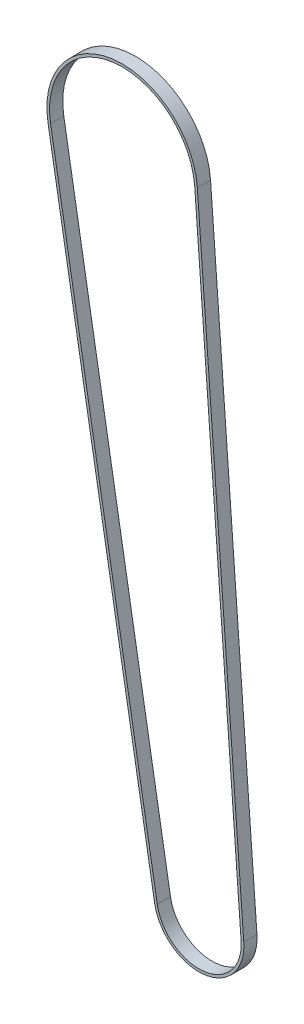
ISO-10303-21;
HEADER;
FILE_DESCRIPTION(('STEP AP214'),'2;1');
FILE_NAME('part.step','',(''),(''),'','','');
FILE_SCHEMA(('AUTOMOTIVE_DESIGN { 1 0 10303 214 1 1 1 1 }'));
ENDSEC;
DATA;
#1=APPLICATION_CONTEXT('core data for automotive mechanical design processes');
#2=APPLICATION_PROTOCOL_DEFINITION('international standard','automotive_design',2000,#1);
#3=PRODUCT_CONTEXT('',#1,'mechanical');
#4=PRODUCT('Part','Part','',(#3));
#5=PRODUCT_RELATED_PRODUCT_CATEGORY('part','',(#4));
#6=PRODUCT_DEFINITION_FORMATION('','',#4);
#7=PRODUCT_DEFINITION_CONTEXT('part definition',#1,'design');
#8=PRODUCT_DEFINITION('design','',#6,#7);
#9=PRODUCT_DEFINITION_SHAPE('','',#8);
#10=(LENGTH_UNIT() NAMED_UNIT(*) SI_UNIT(.MILLI.,.METRE.));
#11=(NAMED_UNIT(*) PLANE_ANGLE_UNIT() SI_UNIT($,.RADIAN.));
#12=(NAMED_UNIT(*) SI_UNIT($,.STERADIAN.) SOLID_ANGLE_UNIT());
#13=UNCERTAINTY_MEASURE_WITH_UNIT(LENGTH_MEASURE(1.E-05),#10,'distance_accuracy_value','');
#14=(GEOMETRIC_REPRESENTATION_CONTEXT(3) GLOBAL_UNCERTAINTY_ASSIGNED_CONTEXT((#13)) GLOBAL_UNIT_ASSIGNED_CONTEXT((#10,
#11,#12)) REPRESENTATION_CONTEXT('',''));
#15=CARTESIAN_POINT('',(0.,0.,0.));
#16=DIRECTION('',(0.,0.,1.));
#17=DIRECTION('',(1.,0.,0.));
#18=AXIS2_PLACEMENT_3D('',#15,#16,#17);
#19=CARTESIAN_POINT('',(0.,0.,10.));
#20=DIRECTION('',(0.,0.,-1.));
#21=DIRECTION('',(-1.,0.,0.));
#22=AXIS2_PLACEMENT_3D('',#19,#20,#21);
#23=PLANE('',#22);
#24=CARTESIAN_POINT('',(0.,0.,10.));
#25=DIRECTION('',(0.,0.,1.));
#26=DIRECTION('',(-1.,0.,0.));
#27=AXIS2_PLACEMENT_3D('',#24,#25,#26);
#28=CIRCLE('',#27,114.);
#29=CARTESIAN_POINT('',(113.692130056024,8.37254819777314,10.));
#30=VERTEX_POINT('',#29);
#31=CARTESIAN_POINT('',(-112.362949875635,-19.2501297462014,10.));
#32=VERTEX_POINT('',#31);
#33=EDGE_CURVE('E140',#30,#32,#28,.T.);
#34=ORIENTED_EDGE('',*,*,#33,.T.);
#35=DIRECTION('',(0.168860787247381,-0.985639911189779,0.));
#36=VECTOR('',#35,1.);
#37=CARTESIAN_POINT('',(49.0612210280597,-961.482533532823,10.));
#38=LINE('',#37,#36);
#39=CARTESIAN_POINT('',(49.0612210280597,-961.482533532823,10.));
#40=VERTEX_POINT('',#39);
#41=EDGE_CURVE('E143',#32,#40,#38,.T.);
#42=ORIENTED_EDGE('',*,*,#41,.T.);
#43=CARTESIAN_POINT('',(116.084734988965,-950.000000000001,10.));
#44=DIRECTION('',(0.,0.,1.));
#45=DIRECTION('',(-1.,0.,0.));
#46=AXIS2_PLACEMENT_3D('',#43,#44,#45);
#47=CIRCLE('',#46,68.);
#48=CARTESIAN_POINT('',(183.901093267997,-945.005848443435,10.));
#49=VERTEX_POINT('',#48);
#50=EDGE_CURVE('E146',#40,#49,#47,.T.);
#51=ORIENTED_EDGE('',*,*,#50,.T.);
#52=DIRECTION('',(-0.0734434052436241,0.997299386456355,0.));
#53=VECTOR('',#52,1.);
#54=CARTESIAN_POINT('',(113.692130056024,8.37254819777314,10.));
#55=LINE('',#54,#53);
#56=EDGE_CURVE('E148',#49,#30,#55,.T.);
#57=ORIENTED_EDGE('',*,*,#56,.T.);
#58=EDGE_LOOP('',(#34,#42,#51,#57));
#59=FACE_BOUND('',#58,.T.);
#60=CARTESIAN_POINT('',(0.,0.,10.));
#61=DIRECTION('',(0.,0.,1.));
#62=DIRECTION('',(-1.,0.,0.));
#63=AXIS2_PLACEMENT_3D('',#60,#61,#62);
#64=CIRCLE('',#63,110.);
#65=CARTESIAN_POINT('',(109.702932510199,8.07877457679865,10.));
#66=VERTEX_POINT('',#65);
#67=CARTESIAN_POINT('',(-108.420390230876,-18.5746865972119,10.));
#68=VERTEX_POINT('',#67);
#69=EDGE_CURVE('E104',#66,#68,#64,.T.);
#70=ORIENTED_EDGE('',*,*,#69,.F.);
#71=DIRECTION('',(-0.073443405243624,0.997299386456354,0.));
#72=VECTOR('',#71,1.);
#73=CARTESIAN_POINT('',(109.702932510199,8.07877457679865,10.));
#74=LINE('',#73,#72);
#75=CARTESIAN_POINT('',(179.911895722171,-945.29962206441,10.));
#76=VERTEX_POINT('',#75);
#77=EDGE_CURVE('E126',#76,#66,#74,.T.);
#78=ORIENTED_EDGE('',*,*,#77,.F.);
#79=CARTESIAN_POINT('',(116.084734988965,-950.000000000001,10.));
#80=DIRECTION('',(0.,0.,1.));
#81=DIRECTION('',(-1.,0.,0.));
#82=AXIS2_PLACEMENT_3D('',#79,#80,#81);
#83=CIRCLE('',#82,64.);
#84=CARTESIAN_POINT('',(53.0037806728188,-960.807090383834,10.));
#85=VERTEX_POINT('',#84);
#86=EDGE_CURVE('E124',#85,#76,#83,.T.);
#87=ORIENTED_EDGE('',*,*,#86,.F.);
#88=DIRECTION('',(0.168860787247381,-0.985639911189779,0.));
#89=VECTOR('',#88,1.);
#90=CARTESIAN_POINT('',(53.0037806728188,-960.807090383834,10.));
#91=LINE('',#90,#89);
#92=EDGE_CURVE('E112',#68,#85,#91,.T.);
#93=ORIENTED_EDGE('',*,*,#92,.F.);
#94=EDGE_LOOP('',(#70,#78,#87,#93));
#95=FACE_BOUND('',#94,.T.);
#96=ADVANCED_FACE('F39',(#59,#95),#23,.F.);
#97=CARTESIAN_POINT('',(0.,0.,-10.));
#98=DIRECTION('',(0.,0.,-1.));
#99=DIRECTION('',(-1.,0.,0.));
#100=AXIS2_PLACEMENT_3D('',#97,#98,#99);
#101=PLANE('',#100);
#102=CARTESIAN_POINT('',(0.,0.,-10.));
#103=DIRECTION('',(0.,0.,1.));
#104=DIRECTION('',(-1.,0.,0.));
#105=AXIS2_PLACEMENT_3D('',#102,#103,#104);
#106=CIRCLE('',#105,114.);
#107=CARTESIAN_POINT('',(113.692130056024,8.37254819777314,-10.));
#108=VERTEX_POINT('',#107);
#109=CARTESIAN_POINT('',(-112.362949875635,-19.2501297462014,-10.));
#110=VERTEX_POINT('',#109);
#111=EDGE_CURVE('E120',#108,#110,#106,.T.);
#112=ORIENTED_EDGE('',*,*,#111,.F.);
#113=DIRECTION('',(-0.0734434052436241,0.997299386456355,0.));
#114=VECTOR('',#113,1.);
#115=CARTESIAN_POINT('',(113.692130056024,8.37254819777314,-10.));
#116=LINE('',#115,#114);
#117=CARTESIAN_POINT('',(183.901093267997,-945.005848443435,-10.));
#118=VERTEX_POINT('',#117);
#119=EDGE_CURVE('E144',#118,#108,#116,.T.);
#120=ORIENTED_EDGE('',*,*,#119,.F.);
#121=CARTESIAN_POINT('',(116.084734988965,-950.000000000001,-10.));
#122=DIRECTION('',(0.,0.,1.));
#123=DIRECTION('',(-1.,0.,0.));
#124=AXIS2_PLACEMENT_3D('',#121,#122,#123);
#125=CIRCLE('',#124,68.);
#126=CARTESIAN_POINT('',(49.0612210280597,-961.482533532823,-10.));
#127=VERTEX_POINT('',#126);
#128=EDGE_CURVE('E155',#127,#118,#125,.T.);
#129=ORIENTED_EDGE('',*,*,#128,.F.);
#130=DIRECTION('',(0.168860787247381,-0.985639911189779,0.));
#131=VECTOR('',#130,1.);
#132=CARTESIAN_POINT('',(49.0612210280597,-961.482533532823,-10.));
#133=LINE('',#132,#131);
#134=EDGE_CURVE('E153',#110,#127,#133,.T.);
#135=ORIENTED_EDGE('',*,*,#134,.F.);
#136=EDGE_LOOP('',(#112,#120,#129,#135));
#137=FACE_BOUND('',#136,.T.);
#138=DIRECTION('',(-0.073443405243624,0.997299386456354,0.));
#139=VECTOR('',#138,1.);
#140=CARTESIAN_POINT('',(109.702932510199,8.07877457679865,-10.));
#141=LINE('',#140,#139);
#142=CARTESIAN_POINT('',(179.911895722171,-945.29962206441,-10.));
#143=VERTEX_POINT('',#142);
#144=CARTESIAN_POINT('',(109.702932510199,8.07877457679865,-10.));
#145=VERTEX_POINT('',#144);
#146=EDGE_CURVE('E113',#143,#145,#141,.T.);
#147=ORIENTED_EDGE('',*,*,#146,.T.);
#148=CARTESIAN_POINT('',(0.,0.,-10.));
#149=DIRECTION('',(0.,0.,1.));
#150=DIRECTION('',(-1.,0.,0.));
#151=AXIS2_PLACEMENT_3D('',#148,#149,#150);
#152=CIRCLE('',#151,110.);
#153=CARTESIAN_POINT('',(-108.420390230876,-18.5746865972119,-10.));
#154=VERTEX_POINT('',#153);
#155=EDGE_CURVE('E62',#145,#154,#152,.T.);
#156=ORIENTED_EDGE('',*,*,#155,.T.);
#157=DIRECTION('',(0.168860787247381,-0.985639911189779,0.));
#158=VECTOR('',#157,1.);
#159=CARTESIAN_POINT('',(53.0037806728188,-960.807090383834,-10.));
#160=LINE('',#159,#158);
#161=CARTESIAN_POINT('',(53.0037806728188,-960.807090383834,-10.));
#162=VERTEX_POINT('',#161);
#163=EDGE_CURVE('E119',#154,#162,#160,.T.);
#164=ORIENTED_EDGE('',*,*,#163,.T.);
#165=CARTESIAN_POINT('',(116.084734988965,-950.000000000001,-10.));
#166=DIRECTION('',(0.,0.,1.));
#167=DIRECTION('',(-1.,0.,0.));
#168=AXIS2_PLACEMENT_3D('',#165,#166,#167);
#169=CIRCLE('',#168,64.);
#170=EDGE_CURVE('E132',#162,#143,#169,.T.);
#171=ORIENTED_EDGE('',*,*,#170,.T.);
#172=EDGE_LOOP('',(#147,#156,#164,#171));
#173=FACE_BOUND('',#172,.T.);
#174=ADVANCED_FACE('F173',(#137,#173),#101,.T.);
#175=CARTESIAN_POINT('',(0.,0.,10.));
#176=DIRECTION('',(0.,0.,-1.));
#177=DIRECTION('',(-1.,0.,0.));
#178=AXIS2_PLACEMENT_3D('',#175,#176,#177);
#179=CYLINDRICAL_SURFACE('',#178,114.);
#180=ORIENTED_EDGE('',*,*,#111,.T.);
#181=DIRECTION('',(0.,0.,-1.));
#182=VECTOR('',#181,1.);
#183=CARTESIAN_POINT('',(-112.362949875635,-19.2501297462014,10.));
#184=LINE('',#183,#182);
#185=EDGE_CURVE('E11',#32,#110,#184,.T.);
#186=ORIENTED_EDGE('',*,*,#185,.F.);
#187=ORIENTED_EDGE('',*,*,#33,.F.);
#188=DIRECTION('',(0.,0.,-1.));
#189=VECTOR('',#188,1.);
#190=CARTESIAN_POINT('',(113.692130056024,8.37254819777314,10.));
#191=LINE('',#190,#189);
#192=EDGE_CURVE('E150',#30,#108,#191,.T.);
#193=ORIENTED_EDGE('',*,*,#192,.T.);
#194=EDGE_LOOP('',(#180,#186,#187,#193));
#195=FACE_BOUND('',#194,.T.);
#196=ADVANCED_FACE('F41',(#195),#179,.T.);
#197=CARTESIAN_POINT('',(49.0612210280597,-961.482533532823,10.));
#198=DIRECTION('',(0.985639911189779,0.168860787247381,0.));
#199=DIRECTION('',(-0.168860787247381,0.985639911189779,0.));
#200=AXIS2_PLACEMENT_3D('',#197,#198,#199);
#201=PLANE('',#200);
#202=ORIENTED_EDGE('',*,*,#134,.T.);
#203=DIRECTION('',(0.,0.,-1.));
#204=VECTOR('',#203,1.);
#205=CARTESIAN_POINT('',(49.0612210280597,-961.482533532823,10.));
#206=LINE('',#205,#204);
#207=EDGE_CURVE('E47',#40,#127,#206,.T.);
#208=ORIENTED_EDGE('',*,*,#207,.F.);
#209=ORIENTED_EDGE('',*,*,#41,.F.);
#210=ORIENTED_EDGE('',*,*,#185,.T.);
#211=EDGE_LOOP('',(#202,#208,#209,#210));
#212=FACE_BOUND('',#211,.T.);
#213=ADVANCED_FACE('F183',(#212),#201,.F.);
#214=CARTESIAN_POINT('',(116.084734988965,-950.000000000001,10.));
#215=DIRECTION('',(0.,0.,-1.));
#216=DIRECTION('',(-1.,0.,0.));
#217=AXIS2_PLACEMENT_3D('',#214,#215,#216);
#218=CYLINDRICAL_SURFACE('',#217,68.);
#219=ORIENTED_EDGE('',*,*,#128,.T.);
#220=DIRECTION('',(0.,0.,-1.));
#221=VECTOR('',#220,1.);
#222=CARTESIAN_POINT('',(183.901093267997,-945.005848443435,10.));
#223=LINE('',#222,#221);
#224=EDGE_CURVE('E160',#49,#118,#223,.T.);
#225=ORIENTED_EDGE('',*,*,#224,.F.);
#226=ORIENTED_EDGE('',*,*,#50,.F.);
#227=ORIENTED_EDGE('',*,*,#207,.T.);
#228=EDGE_LOOP('',(#219,#225,#226,#227));
#229=FACE_BOUND('',#228,.T.);
#230=ADVANCED_FACE('F167',(#229),#218,.T.);
#231=CARTESIAN_POINT('',(113.692130056024,8.37254819777314,10.));
#232=DIRECTION('',(-0.997299386456354,-0.0734434052436241,0.));
#233=DIRECTION('',(0.0734434052436241,-0.997299386456354,0.));
#234=AXIS2_PLACEMENT_3D('',#231,#232,#233);
#235=PLANE('',#234);
#236=ORIENTED_EDGE('',*,*,#119,.T.);
#237=ORIENTED_EDGE('',*,*,#192,.F.);
#238=ORIENTED_EDGE('',*,*,#56,.F.);
#239=ORIENTED_EDGE('',*,*,#224,.T.);
#240=EDGE_LOOP('',(#236,#237,#238,#239));
#241=FACE_BOUND('',#240,.T.);
#242=ADVANCED_FACE('F177',(#241),#235,.F.);
#243=CARTESIAN_POINT('',(0.,0.,10.));
#244=DIRECTION('',(0.,0.,-1.));
#245=DIRECTION('',(-1.,0.,0.));
#246=AXIS2_PLACEMENT_3D('',#243,#244,#245);
#247=CYLINDRICAL_SURFACE('',#246,110.);
#248=ORIENTED_EDGE('',*,*,#155,.F.);
#249=DIRECTION('',(0.,0.,-1.));
#250=VECTOR('',#249,1.);
#251=CARTESIAN_POINT('',(109.702932510199,8.07877457679865,10.));
#252=LINE('',#251,#250);
#253=EDGE_CURVE('E108',#66,#145,#252,.T.);
#254=ORIENTED_EDGE('',*,*,#253,.F.);
#255=ORIENTED_EDGE('',*,*,#69,.T.);
#256=DIRECTION('',(0.,0.,-1.));
#257=VECTOR('',#256,1.);
#258=CARTESIAN_POINT('',(-108.420390230876,-18.5746865972119,10.));
#259=LINE('',#258,#257);
#260=EDGE_CURVE('E107',#68,#154,#259,.T.);
#261=ORIENTED_EDGE('',*,*,#260,.T.);
#262=EDGE_LOOP('',(#248,#254,#255,#261));
#263=FACE_BOUND('',#262,.T.);
#264=ADVANCED_FACE('F106',(#263),#247,.F.);
#265=CARTESIAN_POINT('',(53.0037806728188,-960.807090383834,10.));
#266=DIRECTION('',(0.985639911189779,0.168860787247381,0.));
#267=DIRECTION('',(-0.168860787247381,0.985639911189779,0.));
#268=AXIS2_PLACEMENT_3D('',#265,#266,#267);
#269=PLANE('',#268);
#270=ORIENTED_EDGE('',*,*,#163,.F.);
#271=ORIENTED_EDGE('',*,*,#260,.F.);
#272=ORIENTED_EDGE('',*,*,#92,.T.);
#273=DIRECTION('',(0.,0.,-1.));
#274=VECTOR('',#273,1.);
#275=CARTESIAN_POINT('',(53.0037806728188,-960.807090383834,10.));
#276=LINE('',#275,#274);
#277=EDGE_CURVE('E121',#85,#162,#276,.T.);
#278=ORIENTED_EDGE('',*,*,#277,.T.);
#279=EDGE_LOOP('',(#270,#271,#272,#278));
#280=FACE_BOUND('',#279,.T.);
#281=ADVANCED_FACE('F116',(#280),#269,.T.);
#282=CARTESIAN_POINT('',(116.084734988965,-950.000000000001,10.));
#283=DIRECTION('',(0.,0.,-1.));
#284=DIRECTION('',(-1.,0.,0.));
#285=AXIS2_PLACEMENT_3D('',#282,#283,#284);
#286=CYLINDRICAL_SURFACE('',#285,64.);
#287=ORIENTED_EDGE('',*,*,#170,.F.);
#288=ORIENTED_EDGE('',*,*,#277,.F.);
#289=ORIENTED_EDGE('',*,*,#86,.T.);
#290=DIRECTION('',(0.,0.,-1.));
#291=VECTOR('',#290,1.);
#292=CARTESIAN_POINT('',(179.911895722171,-945.29962206441,10.));
#293=LINE('',#292,#291);
#294=EDGE_CURVE('E54',#76,#143,#293,.T.);
#295=ORIENTED_EDGE('',*,*,#294,.T.);
#296=EDGE_LOOP('',(#287,#288,#289,#295));
#297=FACE_BOUND('',#296,.T.);
#298=ADVANCED_FACE('F206',(#297),#286,.F.);
#299=CARTESIAN_POINT('',(109.702932510199,8.07877457679865,10.));
#300=DIRECTION('',(-0.997299386456354,-0.073443405243624,0.));
#301=DIRECTION('',(0.0734434052436241,-0.997299386456355,0.));
#302=AXIS2_PLACEMENT_3D('',#299,#300,#301);
#303=PLANE('',#302);
#304=ORIENTED_EDGE('',*,*,#146,.F.);
#305=ORIENTED_EDGE('',*,*,#294,.F.);
#306=ORIENTED_EDGE('',*,*,#77,.T.);
#307=ORIENTED_EDGE('',*,*,#253,.T.);
#308=EDGE_LOOP('',(#304,#305,#306,#307));
#309=FACE_BOUND('',#308,.T.);
#310=ADVANCED_FACE('F210',(#309),#303,.T.);
#311=CLOSED_SHELL('',(#96,#174,#196,#213,#230,#242,#264,#281,#298,#310));
#312=MANIFOLD_SOLID_BREP('B2',#311);
#313=ADVANCED_BREP_SHAPE_REPRESENTATION('',(#18,#312),#14);
#314=SHAPE_DEFINITION_REPRESENTATION(#9,#313);
ENDSEC;
END-ISO-10303-21;
